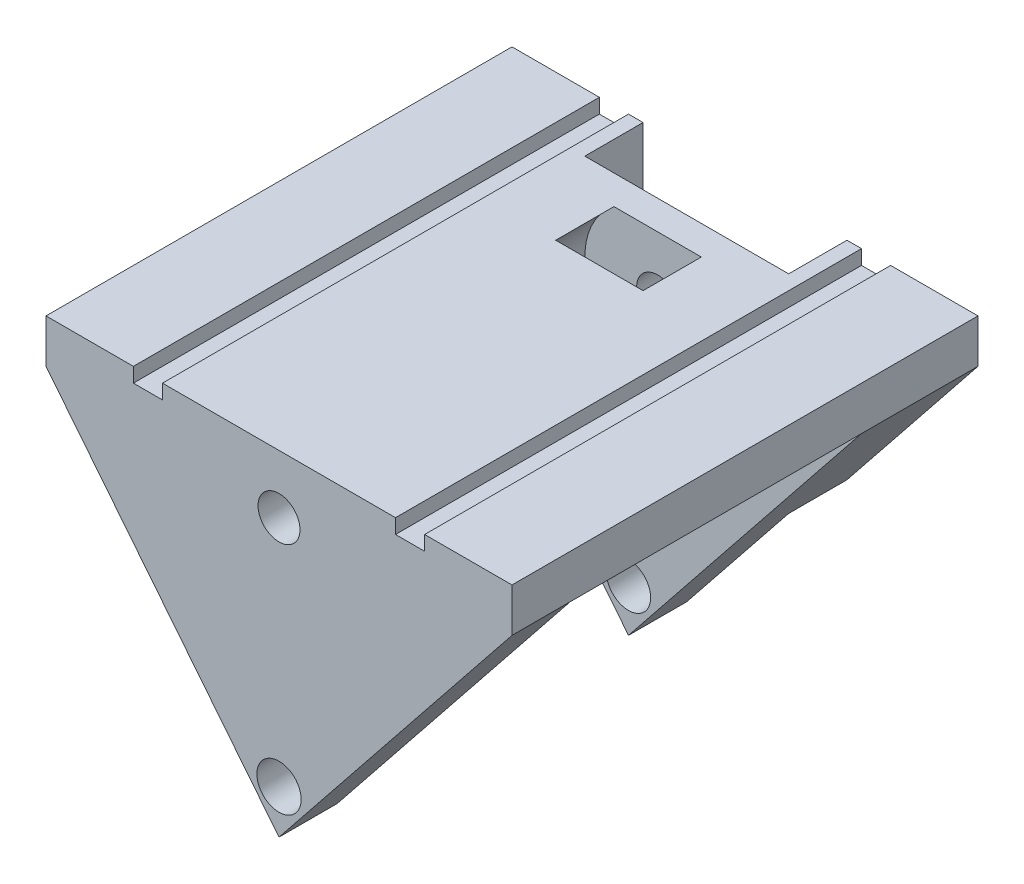
ISO-10303-21;
HEADER;
FILE_DESCRIPTION(('STEP AP214'),'2;1');
FILE_NAME('part.step','',(''),(''),'','','');
FILE_SCHEMA(('AUTOMOTIVE_DESIGN { 1 0 10303 214 1 1 1 1 }'));
ENDSEC;
DATA;
#1=APPLICATION_CONTEXT('core data for automotive mechanical design processes');
#2=APPLICATION_PROTOCOL_DEFINITION('international standard','automotive_design',2000,#1);
#3=PRODUCT_CONTEXT('',#1,'mechanical');
#4=PRODUCT('Part','Part','',(#3));
#5=PRODUCT_RELATED_PRODUCT_CATEGORY('part','',(#4));
#6=PRODUCT_DEFINITION_FORMATION('','',#4);
#7=PRODUCT_DEFINITION_CONTEXT('part definition',#1,'design');
#8=PRODUCT_DEFINITION('design','',#6,#7);
#9=PRODUCT_DEFINITION_SHAPE('','',#8);
#10=(LENGTH_UNIT() NAMED_UNIT(*) SI_UNIT(.MILLI.,.METRE.));
#11=(NAMED_UNIT(*) PLANE_ANGLE_UNIT() SI_UNIT($,.RADIAN.));
#12=(NAMED_UNIT(*) SI_UNIT($,.STERADIAN.) SOLID_ANGLE_UNIT());
#13=UNCERTAINTY_MEASURE_WITH_UNIT(LENGTH_MEASURE(1.E-05),#10,'distance_accuracy_value','');
#14=(GEOMETRIC_REPRESENTATION_CONTEXT(3) GLOBAL_UNCERTAINTY_ASSIGNED_CONTEXT((#13)) GLOBAL_UNIT_ASSIGNED_CONTEXT((#10,
#11,#12)) REPRESENTATION_CONTEXT('',''));
#15=CARTESIAN_POINT('',(0.,0.,0.));
#16=DIRECTION('',(0.,0.,1.));
#17=DIRECTION('',(1.,0.,0.));
#18=AXIS2_PLACEMENT_3D('',#15,#16,#17);
#19=CARTESIAN_POINT('',(0.,4.7625,0.));
#20=DIRECTION('',(0.,-1.,0.));
#21=DIRECTION('',(0.,0.,-1.));
#22=AXIS2_PLACEMENT_3D('',#19,#20,#21);
#23=PLANE('',#22);
#24=DIRECTION('',(1.,0.,0.));
#25=VECTOR('',#24,1.);
#26=CARTESIAN_POINT('',(14.2875,4.7625,-44.45));
#27=LINE('',#26,#25);
#28=CARTESIAN_POINT('',(14.2875,4.7625,-44.45));
#29=VERTEX_POINT('',#28);
#30=CARTESIAN_POINT('',(36.5125,4.7625,-44.45));
#31=VERTEX_POINT('',#30);
#32=EDGE_CURVE('E306',#29,#31,#27,.T.);
#33=ORIENTED_EDGE('',*,*,#32,.F.);
#34=DIRECTION('',(0.,0.,1.));
#35=VECTOR('',#34,1.);
#36=CARTESIAN_POINT('',(14.2875,4.7625,-50.8));
#37=LINE('',#36,#35);
#38=CARTESIAN_POINT('',(14.2875,4.7625,-50.8));
#39=VERTEX_POINT('',#38);
#40=EDGE_CURVE('E302',#39,#29,#37,.T.);
#41=ORIENTED_EDGE('',*,*,#40,.F.);
#42=DIRECTION('',(-1.,0.,0.));
#43=VECTOR('',#42,1.);
#44=CARTESIAN_POINT('',(0.,4.7625,-50.8));
#45=LINE('',#44,#43);
#46=CARTESIAN_POINT('',(12.7,4.7625,-50.8));
#47=VERTEX_POINT('',#46);
#48=EDGE_CURVE('E477',#39,#47,#45,.T.);
#49=ORIENTED_EDGE('',*,*,#48,.T.);
#50=DIRECTION('',(0.,0.,-1.));
#51=VECTOR('',#50,1.);
#52=CARTESIAN_POINT('',(12.7,4.7625,-50.8));
#53=LINE('',#52,#51);
#54=CARTESIAN_POINT('',(12.7,4.7625,0.));
#55=VERTEX_POINT('',#54);
#56=EDGE_CURVE('E388',#55,#47,#53,.T.);
#57=ORIENTED_EDGE('',*,*,#56,.F.);
#58=DIRECTION('',(1.,0.,0.));
#59=VECTOR('',#58,1.);
#60=CARTESIAN_POINT('',(0.,4.7625,0.));
#61=LINE('',#60,#59);
#62=CARTESIAN_POINT('',(38.1,4.7625,0.));
#63=VERTEX_POINT('',#62);
#64=EDGE_CURVE('E467',#55,#63,#61,.T.);
#65=ORIENTED_EDGE('',*,*,#64,.T.);
#66=DIRECTION('',(0.,0.,1.));
#67=VECTOR('',#66,1.);
#68=CARTESIAN_POINT('',(38.1,4.7625,-50.8));
#69=LINE('',#68,#67);
#70=CARTESIAN_POINT('',(38.1,4.7625,-50.8));
#71=VERTEX_POINT('',#70);
#72=EDGE_CURVE('E404',#71,#63,#69,.T.);
#73=ORIENTED_EDGE('',*,*,#72,.F.);
#74=CARTESIAN_POINT('',(36.5125,4.7625,-50.8));
#75=VERTEX_POINT('',#74);
#76=EDGE_CURVE('E476',#71,#75,#45,.T.);
#77=ORIENTED_EDGE('',*,*,#76,.T.);
#78=DIRECTION('',(0.,0.,-1.));
#79=VECTOR('',#78,1.);
#80=CARTESIAN_POINT('',(36.5125,4.7625,-50.8));
#81=LINE('',#80,#79);
#82=EDGE_CURVE('E310',#31,#75,#81,.T.);
#83=ORIENTED_EDGE('',*,*,#82,.F.);
#84=EDGE_LOOP('',(#33,#41,#49,#57,#65,#73,#77,#83));
#85=FACE_BOUND('',#84,.T.);
#86=DIRECTION('',(-1.,0.,0.));
#87=VECTOR('',#86,1.);
#88=CARTESIAN_POINT('',(0.,4.7625,-41.275));
#89=LINE('',#88,#87);
#90=CARTESIAN_POINT('',(30.1625,4.7625,-41.275));
#91=VERTEX_POINT('',#90);
#92=CARTESIAN_POINT('',(20.6375,4.7625,-41.275));
#93=VERTEX_POINT('',#92);
#94=EDGE_CURVE('E233',#91,#93,#89,.T.);
#95=ORIENTED_EDGE('',*,*,#94,.F.);
#96=DIRECTION('',(0.,0.,1.));
#97=VECTOR('',#96,1.);
#98=CARTESIAN_POINT('',(30.1625,4.7625,-41.275));
#99=LINE('',#98,#97);
#100=CARTESIAN_POINT('',(30.1625,4.7625,-34.925));
#101=VERTEX_POINT('',#100);
#102=EDGE_CURVE('E265',#91,#101,#99,.T.);
#103=ORIENTED_EDGE('',*,*,#102,.T.);
#104=DIRECTION('',(-1.,0.,0.));
#105=VECTOR('',#104,1.);
#106=CARTESIAN_POINT('',(0.,4.7625,-34.925));
#107=LINE('',#106,#105);
#108=CARTESIAN_POINT('',(20.6375,4.7625,-34.925));
#109=VERTEX_POINT('',#108);
#110=EDGE_CURVE('E237',#101,#109,#107,.T.);
#111=ORIENTED_EDGE('',*,*,#110,.T.);
#112=DIRECTION('',(0.,0.,1.));
#113=VECTOR('',#112,1.);
#114=CARTESIAN_POINT('',(20.6375,4.7625,-41.275));
#115=LINE('',#114,#113);
#116=EDGE_CURVE('E261',#109,#93,#115,.F.);
#117=ORIENTED_EDGE('',*,*,#116,.T.);
#118=EDGE_LOOP('',(#95,#103,#111,#117));
#119=FACE_BOUND('',#118,.T.);
#120=ADVANCED_FACE('F49',(#85,#119),#23,.F.);
#121=CARTESIAN_POINT('',(25.4,-1.5875,6.35));
#122=DIRECTION('',(0.,0.,-1.));
#123=DIRECTION('',(-1.,0.,0.));
#124=AXIS2_PLACEMENT_3D('',#121,#122,#123);
#125=CYLINDRICAL_SURFACE('',#124,2.286);
#126=CARTESIAN_POINT('',(25.4,-1.5875,-44.45));
#127=DIRECTION('',(0.,0.,-1.));
#128=DIRECTION('',(-1.,0.,0.));
#129=AXIS2_PLACEMENT_3D('',#126,#127,#128);
#130=CIRCLE('',#129,2.286);
#131=CARTESIAN_POINT('',(23.114,-1.5875,-44.45));
#132=VERTEX_POINT('',#131);
#133=EDGE_CURVE('E268',#132,#132,#130,.T.);
#134=ORIENTED_EDGE('',*,*,#133,.T.);
#135=EDGE_LOOP('',(#134));
#136=FACE_BOUND('',#135,.T.);
#137=CARTESIAN_POINT('',(25.4,-1.5875,-41.275));
#138=DIRECTION('',(0.,0.,1.));
#139=DIRECTION('',(1.,0.,0.));
#140=AXIS2_PLACEMENT_3D('',#137,#138,#139);
#141=CIRCLE('',#140,2.286);
#142=CARTESIAN_POINT('',(27.686,-1.5875,-41.275));
#143=VERTEX_POINT('',#142);
#144=EDGE_CURVE('E256',#143,#143,#141,.F.);
#145=ORIENTED_EDGE('',*,*,#144,.F.);
#146=EDGE_LOOP('',(#145));
#147=FACE_BOUND('',#146,.T.);
#148=ADVANCED_FACE('F520',(#136,#147),#125,.F.);
#149=CARTESIAN_POINT('',(0.,0.,0.));
#150=DIRECTION('',(0.,-1.,0.));
#151=DIRECTION('',(0.,0.,-1.));
#152=AXIS2_PLACEMENT_3D('',#149,#150,#151);
#153=PLANE('',#152);
#154=DIRECTION('',(0.,0.,1.));
#155=VECTOR('',#154,1.);
#156=CARTESIAN_POINT('',(17.6228700666634,0.,-41.275));
#157=LINE('',#156,#155);
#158=CARTESIAN_POINT('',(17.6228700666634,0.,-34.925));
#159=VERTEX_POINT('',#158);
#160=CARTESIAN_POINT('',(17.6228700666634,0.,-38.1));
#161=VERTEX_POINT('',#160);
#162=EDGE_CURVE('E232',#159,#161,#157,.F.);
#163=ORIENTED_EDGE('',*,*,#162,.F.);
#164=DIRECTION('',(-1.,0.,0.));
#165=VECTOR('',#164,1.);
#166=CARTESIAN_POINT('',(0.,0.,-34.925));
#167=LINE('',#166,#165);
#168=CARTESIAN_POINT('',(23.7551171014325,0.,-34.925));
#169=VERTEX_POINT('',#168);
#170=EDGE_CURVE('E246',#169,#159,#167,.T.);
#171=ORIENTED_EDGE('',*,*,#170,.F.);
#172=DIRECTION('',(0.,0.,-1.));
#173=VECTOR('',#172,1.);
#174=CARTESIAN_POINT('',(23.7551171014325,0.,6.35));
#175=LINE('',#174,#173);
#176=CARTESIAN_POINT('',(23.7551171014325,0.,-6.35));
#177=VERTEX_POINT('',#176);
#178=EDGE_CURVE('E278',#177,#169,#175,.T.);
#179=ORIENTED_EDGE('',*,*,#178,.F.);
#180=DIRECTION('',(1.,0.,0.));
#181=VECTOR('',#180,1.);
#182=CARTESIAN_POINT('',(0.,0.,-6.35));
#183=LINE('',#182,#181);
#184=CARTESIAN_POINT('',(0.,0.,-6.35));
#185=VERTEX_POINT('',#184);
#186=EDGE_CURVE('E356',#185,#177,#183,.T.);
#187=ORIENTED_EDGE('',*,*,#186,.F.);
#188=DIRECTION('',(0.,0.,1.));
#189=VECTOR('',#188,1.);
#190=CARTESIAN_POINT('',(0.,0.,0.));
#191=LINE('',#190,#189);
#192=CARTESIAN_POINT('',(0.,0.,-38.1));
#193=VERTEX_POINT('',#192);
#194=EDGE_CURVE('E411',#193,#185,#191,.T.);
#195=ORIENTED_EDGE('',*,*,#194,.F.);
#196=DIRECTION('',(-1.,0.,0.));
#197=VECTOR('',#196,1.);
#198=CARTESIAN_POINT('',(0.,0.,-38.1));
#199=LINE('',#198,#197);
#200=EDGE_CURVE('E338',#161,#193,#199,.T.);
#201=ORIENTED_EDGE('',*,*,#200,.F.);
#202=EDGE_LOOP('',(#163,#171,#179,#187,#195,#201));
#203=FACE_BOUND('',#202,.T.);
#204=ADVANCED_FACE('F522',(#203),#153,.T.);
#205=CARTESIAN_POINT('',(0.,4.7625,-50.8));
#206=DIRECTION('',(0.,0.,1.));
#207=DIRECTION('',(1.,0.,0.));
#208=AXIS2_PLACEMENT_3D('',#205,#206,#207);
#209=PLANE('',#208);
#210=ORIENTED_EDGE('',*,*,#48,.F.);
#211=DIRECTION('',(0.,1.,0.));
#212=VECTOR('',#211,1.);
#213=CARTESIAN_POINT('',(14.2875,-39.6875,-50.8));
#214=LINE('',#213,#212);
#215=CARTESIAN_POINT('',(14.2875,-17.859375,-50.8));
#216=VERTEX_POINT('',#215);
#217=EDGE_CURVE('E314',#216,#39,#214,.T.);
#218=ORIENTED_EDGE('',*,*,#217,.F.);
#219=DIRECTION('',(0.624695047554424,-0.78086880944303,0.));
#220=VECTOR('',#219,1.);
#221=CARTESIAN_POINT('',(0.,0.,-50.8));
#222=LINE('',#221,#220);
#223=CARTESIAN_POINT('',(0.,0.,-50.8));
#224=VERTEX_POINT('',#223);
#225=EDGE_CURVE('E335',#224,#216,#222,.T.);
#226=ORIENTED_EDGE('',*,*,#225,.F.);
#227=DIRECTION('',(0.,-1.,0.));
#228=VECTOR('',#227,1.);
#229=CARTESIAN_POINT('',(0.,4.7625,-50.8));
#230=LINE('',#229,#228);
#231=CARTESIAN_POINT('',(0.,4.7625,-50.8));
#232=VERTEX_POINT('',#231);
#233=EDGE_CURVE('E475',#232,#224,#230,.T.);
#234=ORIENTED_EDGE('',*,*,#233,.F.);
#235=CARTESIAN_POINT('',(9.525,4.7625,-50.8));
#236=VERTEX_POINT('',#235);
#237=EDGE_CURVE('E470',#236,#232,#45,.T.);
#238=ORIENTED_EDGE('',*,*,#237,.F.);
#239=DIRECTION('',(0.,1.,0.));
#240=VECTOR('',#239,1.);
#241=CARTESIAN_POINT('',(9.525,3.175,-50.8));
#242=LINE('',#241,#240);
#243=CARTESIAN_POINT('',(9.525,3.175,-50.8));
#244=VERTEX_POINT('',#243);
#245=EDGE_CURVE('E408',#244,#236,#242,.T.);
#246=ORIENTED_EDGE('',*,*,#245,.F.);
#247=DIRECTION('',(-1.,0.,0.));
#248=VECTOR('',#247,1.);
#249=CARTESIAN_POINT('',(9.525,3.175,-50.8));
#250=LINE('',#249,#248);
#251=CARTESIAN_POINT('',(12.7,3.175,-50.8));
#252=VERTEX_POINT('',#251);
#253=EDGE_CURVE('E396',#252,#244,#250,.T.);
#254=ORIENTED_EDGE('',*,*,#253,.F.);
#255=DIRECTION('',(0.,1.,0.));
#256=VECTOR('',#255,1.);
#257=CARTESIAN_POINT('',(12.7,3.175,-50.8));
#258=LINE('',#257,#256);
#259=EDGE_CURVE('E412',#252,#47,#258,.T.);
#260=ORIENTED_EDGE('',*,*,#259,.T.);
#261=EDGE_LOOP('',(#210,#218,#226,#234,#238,#246,#254,#260));
#262=FACE_BOUND('',#261,.T.);
#263=ADVANCED_FACE('F530',(#262),#209,.F.);
#264=DIRECTION('',(0.,0.,1.));
#265=VECTOR('',#264,1.);
#266=CARTESIAN_POINT('',(33.1771299333366,0.,-41.275));
#267=LINE('',#266,#265);
#268=CARTESIAN_POINT('',(33.1771299333366,0.,-38.1));
#269=VERTEX_POINT('',#268);
#270=CARTESIAN_POINT('',(33.1771299333366,0.,-34.925));
#271=VERTEX_POINT('',#270);
#272=EDGE_CURVE('E223',#269,#271,#267,.T.);
#273=ORIENTED_EDGE('',*,*,#272,.F.);
#274=CARTESIAN_POINT('',(50.8,0.,-38.1));
#275=VERTEX_POINT('',#274);
#276=EDGE_CURVE('E339',#275,#269,#199,.T.);
#277=ORIENTED_EDGE('',*,*,#276,.F.);
#278=DIRECTION('',(0.,0.,-1.));
#279=VECTOR('',#278,1.);
#280=CARTESIAN_POINT('',(50.8,0.,0.));
#281=LINE('',#280,#279);
#282=CARTESIAN_POINT('',(50.8,0.,-6.35));
#283=VERTEX_POINT('',#282);
#284=EDGE_CURVE('E482',#283,#275,#281,.T.);
#285=ORIENTED_EDGE('',*,*,#284,.F.);
#286=CARTESIAN_POINT('',(27.0448828985676,0.,-6.35));
#287=VERTEX_POINT('',#286);
#288=EDGE_CURVE('E361',#287,#283,#183,.T.);
#289=ORIENTED_EDGE('',*,*,#288,.F.);
#290=DIRECTION('',(0.,0.,-1.));
#291=VECTOR('',#290,1.);
#292=CARTESIAN_POINT('',(27.0448828985676,0.,6.35));
#293=LINE('',#292,#291);
#294=CARTESIAN_POINT('',(27.0448828985676,0.,-34.925));
#295=VERTEX_POINT('',#294);
#296=EDGE_CURVE('E244',#295,#287,#293,.F.);
#297=ORIENTED_EDGE('',*,*,#296,.F.);
#298=DIRECTION('',(-1.,0.,0.));
#299=VECTOR('',#298,1.);
#300=CARTESIAN_POINT('',(0.,0.,-34.925));
#301=LINE('',#300,#299);
#302=EDGE_CURVE('E72',#271,#295,#301,.T.);
#303=ORIENTED_EDGE('',*,*,#302,.F.);
#304=EDGE_LOOP('',(#273,#277,#285,#289,#297,#303));
#305=FACE_BOUND('',#304,.T.);
#306=ADVANCED_FACE('F242',(#305),#153,.T.);
#307=CARTESIAN_POINT('',(0.,4.7625,0.));
#308=VERTEX_POINT('',#307);
#309=CARTESIAN_POINT('',(9.52500000000001,4.7625,0.));
#310=VERTEX_POINT('',#309);
#311=EDGE_CURVE('E462',#308,#310,#61,.T.);
#312=ORIENTED_EDGE('',*,*,#311,.T.);
#313=DIRECTION('',(0.,0.,1.));
#314=VECTOR('',#313,1.);
#315=CARTESIAN_POINT('',(9.525,4.7625,-50.8));
#316=LINE('',#315,#314);
#317=EDGE_CURVE('E401',#236,#310,#316,.T.);
#318=ORIENTED_EDGE('',*,*,#317,.F.);
#319=ORIENTED_EDGE('',*,*,#237,.T.);
#320=DIRECTION('',(0.,0.,1.));
#321=VECTOR('',#320,1.);
#322=CARTESIAN_POINT('',(0.,4.7625,0.));
#323=LINE('',#322,#321);
#324=EDGE_CURVE('E456',#232,#308,#323,.T.);
#325=ORIENTED_EDGE('',*,*,#324,.T.);
#326=EDGE_LOOP('',(#312,#318,#319,#325));
#327=FACE_BOUND('',#326,.T.);
#328=ADVANCED_FACE('F535',(#327),#23,.F.);
#329=CARTESIAN_POINT('',(0.,4.7625,0.));
#330=DIRECTION('',(1.,0.,0.));
#331=DIRECTION('',(0.,0.,-1.));
#332=AXIS2_PLACEMENT_3D('',#329,#330,#331);
#333=PLANE('',#332);
#334=EDGE_CURVE('E478',#224,#193,#191,.T.);
#335=ORIENTED_EDGE('',*,*,#334,.T.);
#336=ORIENTED_EDGE('',*,*,#194,.T.);
#337=DIRECTION('',(0.,0.,1.));
#338=VECTOR('',#337,1.);
#339=CARTESIAN_POINT('',(0.,0.,-6.35));
#340=LINE('',#339,#338);
#341=CARTESIAN_POINT('',(0.,0.,0.));
#342=VERTEX_POINT('',#341);
#343=EDGE_CURVE('E369',#185,#342,#340,.T.);
#344=ORIENTED_EDGE('',*,*,#343,.T.);
#345=DIRECTION('',(0.,-1.,0.));
#346=VECTOR('',#345,1.);
#347=CARTESIAN_POINT('',(0.,4.7625,0.));
#348=LINE('',#347,#346);
#349=EDGE_CURVE('E496',#308,#342,#348,.T.);
#350=ORIENTED_EDGE('',*,*,#349,.F.);
#351=ORIENTED_EDGE('',*,*,#324,.F.);
#352=ORIENTED_EDGE('',*,*,#233,.T.);
#353=EDGE_LOOP('',(#335,#336,#344,#350,#351,#352));
#354=FACE_BOUND('',#353,.T.);
#355=ADVANCED_FACE('F51',(#354),#333,.F.);
#356=CARTESIAN_POINT('',(0.,4.7625,0.));
#357=DIRECTION('',(0.,0.,-1.));
#358=DIRECTION('',(-1.,0.,0.));
#359=AXIS2_PLACEMENT_3D('',#356,#357,#358);
#360=PLANE('',#359);
#361=CARTESIAN_POINT('',(25.4,-26.9875,0.));
#362=DIRECTION('',(0.,0.,-1.));
#363=DIRECTION('',(-1.,0.,0.));
#364=AXIS2_PLACEMENT_3D('',#361,#362,#363);
#365=CIRCLE('',#364,2.413);
#366=CARTESIAN_POINT('',(22.987,-26.9875,0.));
#367=VERTEX_POINT('',#366);
#368=EDGE_CURVE('E298',#367,#367,#365,.T.);
#369=ORIENTED_EDGE('',*,*,#368,.T.);
#370=EDGE_LOOP('',(#369));
#371=FACE_BOUND('',#370,.T.);
#372=CARTESIAN_POINT('',(25.4,-1.5875,0.));
#373=DIRECTION('',(0.,0.,-1.));
#374=DIRECTION('',(-1.,0.,0.));
#375=AXIS2_PLACEMENT_3D('',#372,#373,#374);
#376=CIRCLE('',#375,2.286);
#377=CARTESIAN_POINT('',(23.114,-1.5875,0.));
#378=VERTEX_POINT('',#377);
#379=EDGE_CURVE('E286',#378,#378,#376,.T.);
#380=ORIENTED_EDGE('',*,*,#379,.T.);
#381=EDGE_LOOP('',(#380));
#382=FACE_BOUND('',#381,.T.);
#383=DIRECTION('',(1.,0.,0.));
#384=VECTOR('',#383,1.);
#385=CARTESIAN_POINT('',(9.52500000000001,3.175,0.));
#386=LINE('',#385,#384);
#387=CARTESIAN_POINT('',(9.52500000000001,3.175,0.));
#388=VERTEX_POINT('',#387);
#389=CARTESIAN_POINT('',(12.7,3.175,0.));
#390=VERTEX_POINT('',#389);
#391=EDGE_CURVE('E387',#388,#390,#386,.T.);
#392=ORIENTED_EDGE('',*,*,#391,.F.);
#393=DIRECTION('',(0.,1.,0.));
#394=VECTOR('',#393,1.);
#395=CARTESIAN_POINT('',(9.52500000000001,3.175,0.));
#396=LINE('',#395,#394);
#397=EDGE_CURVE('E400',#388,#310,#396,.T.);
#398=ORIENTED_EDGE('',*,*,#397,.T.);
#399=ORIENTED_EDGE('',*,*,#311,.F.);
#400=ORIENTED_EDGE('',*,*,#349,.T.);
#401=DIRECTION('',(-0.624695047554424,0.78086880944303,0.));
#402=VECTOR('',#401,1.);
#403=CARTESIAN_POINT('',(0.,0.,0.));
#404=LINE('',#403,#402);
#405=CARTESIAN_POINT('',(25.4,-31.75,0.));
#406=VERTEX_POINT('',#405);
#407=EDGE_CURVE('E352',#406,#342,#404,.T.);
#408=ORIENTED_EDGE('',*,*,#407,.F.);
#409=DIRECTION('',(0.624695047554424,0.78086880944303,0.));
#410=VECTOR('',#409,1.);
#411=CARTESIAN_POINT('',(30.9756097560976,-24.780487804878,0.));
#412=LINE('',#411,#410);
#413=CARTESIAN_POINT('',(50.8,0.,0.));
#414=VERTEX_POINT('',#413);
#415=EDGE_CURVE('E373',#406,#414,#412,.T.);
#416=ORIENTED_EDGE('',*,*,#415,.T.);
#417=DIRECTION('',(0.,-1.,0.));
#418=VECTOR('',#417,1.);
#419=CARTESIAN_POINT('',(50.8,4.7625,0.));
#420=LINE('',#419,#418);
#421=CARTESIAN_POINT('',(50.8,4.7625,0.));
#422=VERTEX_POINT('',#421);
#423=EDGE_CURVE('E493',#422,#414,#420,.T.);
#424=ORIENTED_EDGE('',*,*,#423,.F.);
#425=CARTESIAN_POINT('',(41.275,4.7625,0.));
#426=VERTEX_POINT('',#425);
#427=EDGE_CURVE('E460',#426,#422,#61,.T.);
#428=ORIENTED_EDGE('',*,*,#427,.F.);
#429=DIRECTION('',(0.,1.,0.));
#430=VECTOR('',#429,1.);
#431=CARTESIAN_POINT('',(41.275,3.175,0.));
#432=LINE('',#431,#430);
#433=CARTESIAN_POINT('',(41.275,3.175,0.));
#434=VERTEX_POINT('',#433);
#435=EDGE_CURVE('E427',#434,#426,#432,.T.);
#436=ORIENTED_EDGE('',*,*,#435,.F.);
#437=DIRECTION('',(1.,0.,0.));
#438=VECTOR('',#437,1.);
#439=CARTESIAN_POINT('',(38.1,3.175,0.));
#440=LINE('',#439,#438);
#441=CARTESIAN_POINT('',(38.1,3.175,0.));
#442=VERTEX_POINT('',#441);
#443=EDGE_CURVE('E449',#442,#434,#440,.T.);
#444=ORIENTED_EDGE('',*,*,#443,.F.);
#445=DIRECTION('',(0.,1.,0.));
#446=VECTOR('',#445,1.);
#447=CARTESIAN_POINT('',(38.1,3.175,0.));
#448=LINE('',#447,#446);
#449=EDGE_CURVE('E422',#442,#63,#448,.T.);
#450=ORIENTED_EDGE('',*,*,#449,.T.);
#451=ORIENTED_EDGE('',*,*,#64,.F.);
#452=DIRECTION('',(0.,1.,0.));
#453=VECTOR('',#452,1.);
#454=CARTESIAN_POINT('',(12.7,3.175,0.));
#455=LINE('',#454,#453);
#456=EDGE_CURVE('E416',#390,#55,#455,.T.);
#457=ORIENTED_EDGE('',*,*,#456,.F.);
#458=EDGE_LOOP('',(#392,#398,#399,#400,#408,#416,#424,#428,#436,#444,#450,#451,#457));
#459=FACE_BOUND('',#458,.T.);
#460=ADVANCED_FACE('F558',(#371,#382,#459),#360,.F.);
#461=CARTESIAN_POINT('',(50.8,4.7625,0.));
#462=DIRECTION('',(-1.,0.,0.));
#463=DIRECTION('',(0.,0.,1.));
#464=AXIS2_PLACEMENT_3D('',#461,#462,#463);
#465=PLANE('',#464);
#466=EDGE_CURVE('E461',#414,#283,#281,.T.);
#467=ORIENTED_EDGE('',*,*,#466,.T.);
#468=ORIENTED_EDGE('',*,*,#284,.T.);
#469=DIRECTION('',(0.,0.,-1.));
#470=VECTOR('',#469,1.);
#471=CARTESIAN_POINT('',(50.8,0.,-38.1));
#472=LINE('',#471,#470);
#473=CARTESIAN_POINT('',(50.8,0.,-50.8));
#474=VERTEX_POINT('',#473);
#475=EDGE_CURVE('E348',#275,#474,#472,.T.);
#476=ORIENTED_EDGE('',*,*,#475,.T.);
#477=DIRECTION('',(0.,-1.,0.));
#478=VECTOR('',#477,1.);
#479=CARTESIAN_POINT('',(50.8,4.7625,-50.8));
#480=LINE('',#479,#478);
#481=CARTESIAN_POINT('',(50.8,4.7625,-50.8));
#482=VERTEX_POINT('',#481);
#483=EDGE_CURVE('E489',#482,#474,#480,.T.);
#484=ORIENTED_EDGE('',*,*,#483,.F.);
#485=DIRECTION('',(0.,0.,-1.));
#486=VECTOR('',#485,1.);
#487=CARTESIAN_POINT('',(50.8,4.7625,0.));
#488=LINE('',#487,#486);
#489=EDGE_CURVE('E466',#422,#482,#488,.T.);
#490=ORIENTED_EDGE('',*,*,#489,.F.);
#491=ORIENTED_EDGE('',*,*,#423,.T.);
#492=EDGE_LOOP('',(#467,#468,#476,#484,#490,#491));
#493=FACE_BOUND('',#492,.T.);
#494=ADVANCED_FACE('F561',(#493),#465,.F.);
#495=DIRECTION('',(0.624695047554424,0.78086880944303,0.));
#496=VECTOR('',#495,1.);
#497=CARTESIAN_POINT('',(30.9756097560976,-24.780487804878,-50.8));
#498=LINE('',#497,#496);
#499=CARTESIAN_POINT('',(36.5125,-17.859375,-50.8));
#500=VERTEX_POINT('',#499);
#501=EDGE_CURVE('E330',#500,#474,#498,.T.);
#502=ORIENTED_EDGE('',*,*,#501,.F.);
#503=DIRECTION('',(0.,1.,0.));
#504=VECTOR('',#503,1.);
#505=CARTESIAN_POINT('',(36.5125,-39.6875,-50.8));
#506=LINE('',#505,#504);
#507=EDGE_CURVE('E318',#500,#75,#506,.T.);
#508=ORIENTED_EDGE('',*,*,#507,.T.);
#509=ORIENTED_EDGE('',*,*,#76,.F.);
#510=DIRECTION('',(0.,1.,0.));
#511=VECTOR('',#510,1.);
#512=CARTESIAN_POINT('',(38.1,3.175,-50.8));
#513=LINE('',#512,#511);
#514=CARTESIAN_POINT('',(38.1,3.175,-50.8));
#515=VERTEX_POINT('',#514);
#516=EDGE_CURVE('E380',#515,#71,#513,.T.);
#517=ORIENTED_EDGE('',*,*,#516,.F.);
#518=DIRECTION('',(-1.,0.,0.));
#519=VECTOR('',#518,1.);
#520=CARTESIAN_POINT('',(38.1,3.175,-50.8));
#521=LINE('',#520,#519);
#522=CARTESIAN_POINT('',(41.275,3.175,-50.8));
#523=VERTEX_POINT('',#522);
#524=EDGE_CURVE('E426',#523,#515,#521,.T.);
#525=ORIENTED_EDGE('',*,*,#524,.F.);
#526=DIRECTION('',(0.,1.,0.));
#527=VECTOR('',#526,1.);
#528=CARTESIAN_POINT('',(41.275,3.175,-50.8));
#529=LINE('',#528,#527);
#530=CARTESIAN_POINT('',(41.275,4.7625,-50.8));
#531=VERTEX_POINT('',#530);
#532=EDGE_CURVE('E430',#523,#531,#529,.T.);
#533=ORIENTED_EDGE('',*,*,#532,.T.);
#534=EDGE_CURVE('E471',#482,#531,#45,.T.);
#535=ORIENTED_EDGE('',*,*,#534,.F.);
#536=ORIENTED_EDGE('',*,*,#483,.T.);
#537=EDGE_LOOP('',(#502,#508,#509,#517,#525,#533,#535,#536));
#538=FACE_BOUND('',#537,.T.);
#539=ADVANCED_FACE('F592',(#538),#209,.F.);
#540=ORIENTED_EDGE('',*,*,#534,.T.);
#541=DIRECTION('',(0.,0.,-1.));
#542=VECTOR('',#541,1.);
#543=CARTESIAN_POINT('',(41.275,4.7625,-50.8));
#544=LINE('',#543,#542);
#545=EDGE_CURVE('E436',#426,#531,#544,.T.);
#546=ORIENTED_EDGE('',*,*,#545,.F.);
#547=ORIENTED_EDGE('',*,*,#427,.T.);
#548=ORIENTED_EDGE('',*,*,#489,.T.);
#549=EDGE_LOOP('',(#540,#546,#547,#548));
#550=FACE_BOUND('',#549,.T.);
#551=ADVANCED_FACE('F536',(#550),#23,.F.);
#552=CARTESIAN_POINT('',(38.1,3.175,-50.8));
#553=DIRECTION('',(-1.,0.,0.));
#554=DIRECTION('',(0.,0.,1.));
#555=AXIS2_PLACEMENT_3D('',#552,#553,#554);
#556=PLANE('',#555);
#557=ORIENTED_EDGE('',*,*,#72,.T.);
#558=ORIENTED_EDGE('',*,*,#449,.F.);
#559=DIRECTION('',(0.,0.,1.));
#560=VECTOR('',#559,1.);
#561=CARTESIAN_POINT('',(38.1,3.175,-50.8));
#562=LINE('',#561,#560);
#563=EDGE_CURVE('E439',#515,#442,#562,.T.);
#564=ORIENTED_EDGE('',*,*,#563,.F.);
#565=ORIENTED_EDGE('',*,*,#516,.T.);
#566=EDGE_LOOP('',(#557,#558,#564,#565));
#567=FACE_BOUND('',#566,.T.);
#568=ADVANCED_FACE('F626',(#567),#556,.F.);
#569=CARTESIAN_POINT('',(41.275,3.175,-50.8));
#570=DIRECTION('',(1.,0.,0.));
#571=DIRECTION('',(0.,0.,-1.));
#572=AXIS2_PLACEMENT_3D('',#569,#570,#571);
#573=PLANE('',#572);
#574=ORIENTED_EDGE('',*,*,#545,.T.);
#575=ORIENTED_EDGE('',*,*,#532,.F.);
#576=DIRECTION('',(0.,0.,-1.));
#577=VECTOR('',#576,1.);
#578=CARTESIAN_POINT('',(41.275,3.175,-50.8));
#579=LINE('',#578,#577);
#580=EDGE_CURVE('E445',#434,#523,#579,.T.);
#581=ORIENTED_EDGE('',*,*,#580,.F.);
#582=ORIENTED_EDGE('',*,*,#435,.T.);
#583=EDGE_LOOP('',(#574,#575,#581,#582));
#584=FACE_BOUND('',#583,.T.);
#585=ADVANCED_FACE('F629',(#584),#573,.F.);
#586=CARTESIAN_POINT('',(0.,3.175,0.));
#587=DIRECTION('',(0.,1.,0.));
#588=DIRECTION('',(0.,0.,1.));
#589=AXIS2_PLACEMENT_3D('',#586,#587,#588);
#590=PLANE('',#589);
#591=ORIENTED_EDGE('',*,*,#563,.T.);
#592=ORIENTED_EDGE('',*,*,#443,.T.);
#593=ORIENTED_EDGE('',*,*,#580,.T.);
#594=ORIENTED_EDGE('',*,*,#524,.T.);
#595=EDGE_LOOP('',(#591,#592,#593,#594));
#596=FACE_BOUND('',#595,.T.);
#597=ADVANCED_FACE('F622',(#596),#590,.T.);
#598=CARTESIAN_POINT('',(9.525,3.175,-50.8));
#599=DIRECTION('',(-1.,0.,0.));
#600=DIRECTION('',(0.,0.,1.));
#601=AXIS2_PLACEMENT_3D('',#598,#599,#600);
#602=PLANE('',#601);
#603=ORIENTED_EDGE('',*,*,#317,.T.);
#604=ORIENTED_EDGE('',*,*,#397,.F.);
#605=DIRECTION('',(0.,0.,1.));
#606=VECTOR('',#605,1.);
#607=CARTESIAN_POINT('',(9.525,3.175,-50.8));
#608=LINE('',#607,#606);
#609=EDGE_CURVE('E383',#244,#388,#608,.T.);
#610=ORIENTED_EDGE('',*,*,#609,.F.);
#611=ORIENTED_EDGE('',*,*,#245,.T.);
#612=EDGE_LOOP('',(#603,#604,#610,#611));
#613=FACE_BOUND('',#612,.T.);
#614=ADVANCED_FACE('F571',(#613),#602,.F.);
#615=CARTESIAN_POINT('',(12.7,3.175,-50.8));
#616=DIRECTION('',(1.,0.,0.));
#617=DIRECTION('',(0.,0.,-1.));
#618=AXIS2_PLACEMENT_3D('',#615,#616,#617);
#619=PLANE('',#618);
#620=ORIENTED_EDGE('',*,*,#56,.T.);
#621=ORIENTED_EDGE('',*,*,#259,.F.);
#622=DIRECTION('',(0.,0.,-1.));
#623=VECTOR('',#622,1.);
#624=CARTESIAN_POINT('',(12.7,3.175,-50.8));
#625=LINE('',#624,#623);
#626=EDGE_CURVE('E392',#390,#252,#625,.T.);
#627=ORIENTED_EDGE('',*,*,#626,.F.);
#628=ORIENTED_EDGE('',*,*,#456,.T.);
#629=EDGE_LOOP('',(#620,#621,#627,#628));
#630=FACE_BOUND('',#629,.T.);
#631=ADVANCED_FACE('F613',(#630),#619,.F.);
#632=CARTESIAN_POINT('',(0.,3.175,0.));
#633=DIRECTION('',(0.,1.,0.));
#634=DIRECTION('',(0.,0.,1.));
#635=AXIS2_PLACEMENT_3D('',#632,#633,#634);
#636=PLANE('',#635);
#637=ORIENTED_EDGE('',*,*,#609,.T.);
#638=ORIENTED_EDGE('',*,*,#391,.T.);
#639=ORIENTED_EDGE('',*,*,#626,.T.);
#640=ORIENTED_EDGE('',*,*,#253,.T.);
#641=EDGE_LOOP('',(#637,#638,#639,#640));
#642=FACE_BOUND('',#641,.T.);
#643=ADVANCED_FACE('F567',(#642),#636,.T.);
#644=CARTESIAN_POINT('',(30.9756097560976,-24.780487804878,-6.35));
#645=DIRECTION('',(0.78086880944303,-0.624695047554424,0.));
#646=DIRECTION('',(0.624695047554424,0.780868809443031,0.));
#647=AXIS2_PLACEMENT_3D('',#644,#645,#646);
#648=PLANE('',#647);
#649=ORIENTED_EDGE('',*,*,#415,.F.);
#650=DIRECTION('',(0.,0.,1.));
#651=VECTOR('',#650,1.);
#652=CARTESIAN_POINT('',(25.4,-31.75,-6.35));
#653=LINE('',#652,#651);
#654=CARTESIAN_POINT('',(25.4,-31.75,-6.35));
#655=VERTEX_POINT('',#654);
#656=EDGE_CURVE('E377',#655,#406,#653,.T.);
#657=ORIENTED_EDGE('',*,*,#656,.F.);
#658=DIRECTION('',(0.624695047554424,0.78086880944303,0.));
#659=VECTOR('',#658,1.);
#660=CARTESIAN_POINT('',(30.9756097560976,-24.780487804878,-6.35));
#661=LINE('',#660,#659);
#662=EDGE_CURVE('E365',#655,#283,#661,.T.);
#663=ORIENTED_EDGE('',*,*,#662,.T.);
#664=ORIENTED_EDGE('',*,*,#466,.F.);
#665=EDGE_LOOP('',(#649,#657,#663,#664));
#666=FACE_BOUND('',#665,.T.);
#667=ADVANCED_FACE('F620',(#666),#648,.T.);
#668=CARTESIAN_POINT('',(0.,0.,-6.35));
#669=DIRECTION('',(0.78086880944303,0.624695047554424,0.));
#670=DIRECTION('',(-0.624695047554424,0.78086880944303,0.));
#671=AXIS2_PLACEMENT_3D('',#668,#669,#670);
#672=PLANE('',#671);
#673=ORIENTED_EDGE('',*,*,#407,.T.);
#674=ORIENTED_EDGE('',*,*,#343,.F.);
#675=DIRECTION('',(-0.624695047554424,0.78086880944303,0.));
#676=VECTOR('',#675,1.);
#677=CARTESIAN_POINT('',(0.,0.,-6.35));
#678=LINE('',#677,#676);
#679=EDGE_CURVE('E360',#655,#185,#678,.T.);
#680=ORIENTED_EDGE('',*,*,#679,.F.);
#681=ORIENTED_EDGE('',*,*,#656,.T.);
#682=EDGE_LOOP('',(#673,#674,#680,#681));
#683=FACE_BOUND('',#682,.T.);
#684=ADVANCED_FACE('F674',(#683),#672,.F.);
#685=CARTESIAN_POINT('',(0.,0.,-6.35));
#686=DIRECTION('',(0.,0.,1.));
#687=DIRECTION('',(1.,0.,0.));
#688=AXIS2_PLACEMENT_3D('',#685,#686,#687);
#689=PLANE('',#688);
#690=CARTESIAN_POINT('',(25.4,-26.9875,-6.35));
#691=DIRECTION('',(0.,0.,1.));
#692=DIRECTION('',(1.,0.,0.));
#693=AXIS2_PLACEMENT_3D('',#690,#691,#692);
#694=CIRCLE('',#693,2.413);
#695=CARTESIAN_POINT('',(27.813,-26.9875,-6.35));
#696=VERTEX_POINT('',#695);
#697=EDGE_CURVE('E294',#696,#696,#694,.T.);
#698=ORIENTED_EDGE('',*,*,#697,.T.);
#699=EDGE_LOOP('',(#698));
#700=FACE_BOUND('',#699,.T.);
#701=ORIENTED_EDGE('',*,*,#186,.T.);
#702=CARTESIAN_POINT('',(25.4,-1.5875,-6.35));
#703=DIRECTION('',(0.,0.,1.));
#704=DIRECTION('',(1.,0.,0.));
#705=AXIS2_PLACEMENT_3D('',#702,#703,#704);
#706=CIRCLE('',#705,2.286);
#707=EDGE_CURVE('E282',#177,#287,#706,.T.);
#708=ORIENTED_EDGE('',*,*,#707,.T.);
#709=ORIENTED_EDGE('',*,*,#288,.T.);
#710=ORIENTED_EDGE('',*,*,#662,.F.);
#711=ORIENTED_EDGE('',*,*,#679,.T.);
#712=EDGE_LOOP('',(#701,#708,#709,#710,#711));
#713=FACE_BOUND('',#712,.T.);
#714=ADVANCED_FACE('F659',(#700,#713),#689,.F.);
#715=CARTESIAN_POINT('',(30.9756097560976,-24.780487804878,-38.1));
#716=DIRECTION('',(-0.78086880944303,0.624695047554424,0.));
#717=DIRECTION('',(-0.624695047554424,-0.780868809443031,0.));
#718=AXIS2_PLACEMENT_3D('',#715,#716,#717);
#719=PLANE('',#718);
#720=DIRECTION('',(0.624695047554424,0.780868809443031,0.));
#721=VECTOR('',#720,1.);
#722=CARTESIAN_POINT('',(30.9756097560976,-24.780487804878,-44.45));
#723=LINE('',#722,#721);
#724=CARTESIAN_POINT('',(25.4,-31.75,-44.45));
#725=VERTEX_POINT('',#724);
#726=CARTESIAN_POINT('',(36.5125,-17.859375,-44.45));
#727=VERTEX_POINT('',#726);
#728=EDGE_CURVE('E317',#725,#727,#723,.T.);
#729=ORIENTED_EDGE('',*,*,#728,.T.);
#730=DIRECTION('',(0.,0.,-1.));
#731=VECTOR('',#730,1.);
#732=CARTESIAN_POINT('',(36.5125,-17.859375,-38.1));
#733=LINE('',#732,#731);
#734=EDGE_CURVE('E508',#727,#500,#733,.T.);
#735=ORIENTED_EDGE('',*,*,#734,.T.);
#736=ORIENTED_EDGE('',*,*,#501,.T.);
#737=ORIENTED_EDGE('',*,*,#475,.F.);
#738=DIRECTION('',(0.624695047554424,0.78086880944303,0.));
#739=VECTOR('',#738,1.);
#740=CARTESIAN_POINT('',(30.9756097560976,-24.780487804878,-38.1));
#741=LINE('',#740,#739);
#742=CARTESIAN_POINT('',(25.4,-31.75,-38.1));
#743=VERTEX_POINT('',#742);
#744=EDGE_CURVE('E331',#743,#275,#741,.T.);
#745=ORIENTED_EDGE('',*,*,#744,.F.);
#746=DIRECTION('',(0.,0.,-1.));
#747=VECTOR('',#746,1.);
#748=CARTESIAN_POINT('',(25.4,-31.75,-38.1));
#749=LINE('',#748,#747);
#750=EDGE_CURVE('E342',#743,#725,#749,.T.);
#751=ORIENTED_EDGE('',*,*,#750,.T.);
#752=EDGE_LOOP('',(#729,#735,#736,#737,#745,#751));
#753=FACE_BOUND('',#752,.T.);
#754=ADVANCED_FACE('F598',(#753),#719,.F.);
#755=CARTESIAN_POINT('',(0.,0.,-38.1));
#756=DIRECTION('',(0.78086880944303,0.624695047554424,0.));
#757=DIRECTION('',(-0.624695047554424,0.78086880944303,0.));
#758=AXIS2_PLACEMENT_3D('',#755,#756,#757);
#759=PLANE('',#758);
#760=ORIENTED_EDGE('',*,*,#225,.T.);
#761=DIRECTION('',(0.,0.,1.));
#762=VECTOR('',#761,1.);
#763=CARTESIAN_POINT('',(14.2875,-17.859375,-38.1));
#764=LINE('',#763,#762);
#765=CARTESIAN_POINT('',(14.2875,-17.859375,-44.45));
#766=VERTEX_POINT('',#765);
#767=EDGE_CURVE('E504',#216,#766,#764,.T.);
#768=ORIENTED_EDGE('',*,*,#767,.T.);
#769=DIRECTION('',(0.624695047554424,-0.78086880944303,0.));
#770=VECTOR('',#769,1.);
#771=CARTESIAN_POINT('',(0.,0.,-44.45));
#772=LINE('',#771,#770);
#773=EDGE_CURVE('E500',#766,#725,#772,.T.);
#774=ORIENTED_EDGE('',*,*,#773,.T.);
#775=ORIENTED_EDGE('',*,*,#750,.F.);
#776=DIRECTION('',(0.624695047554424,-0.78086880944303,0.));
#777=VECTOR('',#776,1.);
#778=CARTESIAN_POINT('',(0.,0.,-38.1));
#779=LINE('',#778,#777);
#780=EDGE_CURVE('E334',#193,#743,#779,.T.);
#781=ORIENTED_EDGE('',*,*,#780,.F.);
#782=ORIENTED_EDGE('',*,*,#334,.F.);
#783=EDGE_LOOP('',(#760,#768,#774,#775,#781,#782));
#784=FACE_BOUND('',#783,.T.);
#785=ADVANCED_FACE('F605',(#784),#759,.F.);
#786=CARTESIAN_POINT('',(0.,0.,-38.1));
#787=DIRECTION('',(0.,0.,-1.));
#788=DIRECTION('',(-1.,0.,0.));
#789=AXIS2_PLACEMENT_3D('',#786,#787,#788);
#790=PLANE('',#789);
#791=CARTESIAN_POINT('',(25.4,-26.9875,-38.1));
#792=DIRECTION('',(0.,0.,-1.));
#793=DIRECTION('',(-1.,0.,0.));
#794=AXIS2_PLACEMENT_3D('',#791,#792,#793);
#795=CIRCLE('',#794,2.413);
#796=CARTESIAN_POINT('',(22.987,-26.9875,-38.1));
#797=VERTEX_POINT('',#796);
#798=EDGE_CURVE('E290',#797,#797,#795,.T.);
#799=ORIENTED_EDGE('',*,*,#798,.T.);
#800=EDGE_LOOP('',(#799));
#801=FACE_BOUND('',#800,.T.);
#802=ORIENTED_EDGE('',*,*,#276,.T.);
#803=CARTESIAN_POINT('',(25.4,-1.5875,-38.1));
#804=DIRECTION('',(0.,0.,-1.));
#805=DIRECTION('',(-1.,0.,0.));
#806=AXIS2_PLACEMENT_3D('',#803,#804,#805);
#807=CIRCLE('',#806,7.93750000000001);
#808=EDGE_CURVE('E11',#269,#161,#807,.T.);
#809=ORIENTED_EDGE('',*,*,#808,.T.);
#810=ORIENTED_EDGE('',*,*,#200,.T.);
#811=ORIENTED_EDGE('',*,*,#780,.T.);
#812=ORIENTED_EDGE('',*,*,#744,.T.);
#813=EDGE_LOOP('',(#802,#809,#810,#811,#812));
#814=FACE_BOUND('',#813,.T.);
#815=ADVANCED_FACE('F665',(#801,#814),#790,.F.);
#816=CARTESIAN_POINT('',(36.5125,-39.6875,-50.8));
#817=DIRECTION('',(1.,0.,0.));
#818=DIRECTION('',(0.,0.,-1.));
#819=AXIS2_PLACEMENT_3D('',#816,#817,#818);
#820=PLANE('',#819);
#821=DIRECTION('',(0.,1.,0.));
#822=VECTOR('',#821,1.);
#823=CARTESIAN_POINT('',(36.5125,-39.6875,-44.45));
#824=LINE('',#823,#822);
#825=EDGE_CURVE('E322',#727,#31,#824,.T.);
#826=ORIENTED_EDGE('',*,*,#825,.T.);
#827=ORIENTED_EDGE('',*,*,#82,.T.);
#828=ORIENTED_EDGE('',*,*,#507,.F.);
#829=ORIENTED_EDGE('',*,*,#734,.F.);
#830=EDGE_LOOP('',(#826,#827,#828,#829));
#831=FACE_BOUND('',#830,.T.);
#832=ADVANCED_FACE('F595',(#831),#820,.F.);
#833=CARTESIAN_POINT('',(14.2875,-39.6875,-50.8));
#834=DIRECTION('',(-1.,0.,0.));
#835=DIRECTION('',(0.,0.,1.));
#836=AXIS2_PLACEMENT_3D('',#833,#834,#835);
#837=PLANE('',#836);
#838=ORIENTED_EDGE('',*,*,#217,.T.);
#839=ORIENTED_EDGE('',*,*,#40,.T.);
#840=DIRECTION('',(0.,1.,0.));
#841=VECTOR('',#840,1.);
#842=CARTESIAN_POINT('',(14.2875,-39.6875,-44.45));
#843=LINE('',#842,#841);
#844=EDGE_CURVE('E313',#766,#29,#843,.T.);
#845=ORIENTED_EDGE('',*,*,#844,.F.);
#846=ORIENTED_EDGE('',*,*,#767,.F.);
#847=EDGE_LOOP('',(#838,#839,#845,#846));
#848=FACE_BOUND('',#847,.T.);
#849=ADVANCED_FACE('F551',(#848),#837,.F.);
#850=CARTESIAN_POINT('',(14.2875,-39.6875,-44.45));
#851=DIRECTION('',(0.,0.,1.));
#852=DIRECTION('',(1.,0.,0.));
#853=AXIS2_PLACEMENT_3D('',#850,#851,#852);
#854=PLANE('',#853);
#855=CARTESIAN_POINT('',(25.4,-26.9875,-44.45));
#856=DIRECTION('',(0.,0.,-1.));
#857=DIRECTION('',(-1.,0.,0.));
#858=AXIS2_PLACEMENT_3D('',#855,#856,#857);
#859=CIRCLE('',#858,2.413);
#860=CARTESIAN_POINT('',(22.987,-26.9875,-44.45));
#861=VERTEX_POINT('',#860);
#862=EDGE_CURVE('E269',#861,#861,#859,.T.);
#863=ORIENTED_EDGE('',*,*,#862,.F.);
#864=EDGE_LOOP('',(#863));
#865=FACE_BOUND('',#864,.T.);
#866=ORIENTED_EDGE('',*,*,#133,.F.);
#867=EDGE_LOOP('',(#866));
#868=FACE_BOUND('',#867,.T.);
#869=ORIENTED_EDGE('',*,*,#773,.F.);
#870=ORIENTED_EDGE('',*,*,#844,.T.);
#871=ORIENTED_EDGE('',*,*,#32,.T.);
#872=ORIENTED_EDGE('',*,*,#825,.F.);
#873=ORIENTED_EDGE('',*,*,#728,.F.);
#874=EDGE_LOOP('',(#869,#870,#871,#872,#873));
#875=FACE_BOUND('',#874,.T.);
#876=ADVANCED_FACE('F541',(#865,#868,#875),#854,.F.);
#877=ORIENTED_EDGE('',*,*,#178,.T.);
#878=CARTESIAN_POINT('',(25.4,-1.5875,-34.925));
#879=DIRECTION('',(0.,0.,1.));
#880=DIRECTION('',(1.,0.,0.));
#881=AXIS2_PLACEMENT_3D('',#878,#879,#880);
#882=CIRCLE('',#881,2.286);
#883=EDGE_CURVE('E58',#169,#295,#882,.F.);
#884=ORIENTED_EDGE('',*,*,#883,.T.);
#885=ORIENTED_EDGE('',*,*,#296,.T.);
#886=ORIENTED_EDGE('',*,*,#707,.F.);
#887=EDGE_LOOP('',(#877,#884,#885,#886));
#888=FACE_BOUND('',#887,.T.);
#889=ORIENTED_EDGE('',*,*,#379,.F.);
#890=EDGE_LOOP('',(#889));
#891=FACE_BOUND('',#890,.T.);
#892=ADVANCED_FACE('F525',(#888,#891),#125,.F.);
#893=CARTESIAN_POINT('',(25.4,-26.9875,6.35));
#894=DIRECTION('',(0.,0.,-1.));
#895=DIRECTION('',(-1.,0.,0.));
#896=AXIS2_PLACEMENT_3D('',#893,#894,#895);
#897=CYLINDRICAL_SURFACE('',#896,2.413);
#898=ORIENTED_EDGE('',*,*,#862,.T.);
#899=EDGE_LOOP('',(#898));
#900=FACE_BOUND('',#899,.T.);
#901=ORIENTED_EDGE('',*,*,#798,.F.);
#902=EDGE_LOOP('',(#901));
#903=FACE_BOUND('',#902,.T.);
#904=ADVANCED_FACE('F540',(#900,#903),#897,.F.);
#905=ORIENTED_EDGE('',*,*,#697,.F.);
#906=EDGE_LOOP('',(#905));
#907=FACE_BOUND('',#906,.T.);
#908=ORIENTED_EDGE('',*,*,#368,.F.);
#909=EDGE_LOOP('',(#908));
#910=FACE_BOUND('',#909,.T.);
#911=ADVANCED_FACE('F548',(#907,#910),#897,.F.);
#912=CARTESIAN_POINT('',(25.4,-1.5875,-41.275));
#913=DIRECTION('',(0.,0.,1.));
#914=DIRECTION('',(1.,0.,0.));
#915=AXIS2_PLACEMENT_3D('',#912,#913,#914);
#916=CYLINDRICAL_SURFACE('',#915,7.93750000000001);
#917=CARTESIAN_POINT('',(25.4,-1.5875,-41.275));
#918=DIRECTION('',(0.,0.,1.));
#919=DIRECTION('',(1.,0.,0.));
#920=AXIS2_PLACEMENT_3D('',#917,#918,#919);
#921=CIRCLE('',#920,7.93750000000001);
#922=EDGE_CURVE('E239',#93,#91,#921,.T.);
#923=ORIENTED_EDGE('',*,*,#922,.F.);
#924=ORIENTED_EDGE('',*,*,#116,.F.);
#925=CARTESIAN_POINT('',(25.4,-1.5875,-34.925));
#926=DIRECTION('',(0.,0.,1.));
#927=DIRECTION('',(1.,0.,0.));
#928=AXIS2_PLACEMENT_3D('',#925,#926,#927);
#929=CIRCLE('',#928,7.93750000000001);
#930=EDGE_CURVE('E65',#109,#159,#929,.T.);
#931=ORIENTED_EDGE('',*,*,#930,.T.);
#932=ORIENTED_EDGE('',*,*,#162,.T.);
#933=ORIENTED_EDGE('',*,*,#808,.F.);
#934=ORIENTED_EDGE('',*,*,#272,.T.);
#935=EDGE_CURVE('E226',#271,#101,#929,.T.);
#936=ORIENTED_EDGE('',*,*,#935,.T.);
#937=ORIENTED_EDGE('',*,*,#102,.F.);
#938=EDGE_LOOP('',(#923,#924,#931,#932,#933,#934,#936,#937));
#939=FACE_BOUND('',#938,.T.);
#940=ADVANCED_FACE('F225',(#939),#916,.F.);
#941=CARTESIAN_POINT('',(25.4,-1.5875,-41.275));
#942=DIRECTION('',(0.,0.,1.));
#943=DIRECTION('',(1.,0.,0.));
#944=AXIS2_PLACEMENT_3D('',#941,#942,#943);
#945=PLANE('',#944);
#946=ORIENTED_EDGE('',*,*,#144,.T.);
#947=EDGE_LOOP('',(#946));
#948=FACE_BOUND('',#947,.T.);
#949=ORIENTED_EDGE('',*,*,#94,.T.);
#950=ORIENTED_EDGE('',*,*,#922,.T.);
#951=EDGE_LOOP('',(#949,#950));
#952=FACE_BOUND('',#951,.T.);
#953=ADVANCED_FACE('F517',(#948,#952),#945,.T.);
#954=CARTESIAN_POINT('',(25.4,-1.5875,-34.925));
#955=DIRECTION('',(0.,0.,1.));
#956=DIRECTION('',(1.,0.,0.));
#957=AXIS2_PLACEMENT_3D('',#954,#955,#956);
#958=PLANE('',#957);
#959=ORIENTED_EDGE('',*,*,#935,.F.);
#960=ORIENTED_EDGE('',*,*,#302,.T.);
#961=ORIENTED_EDGE('',*,*,#883,.F.);
#962=ORIENTED_EDGE('',*,*,#170,.T.);
#963=ORIENTED_EDGE('',*,*,#930,.F.);
#964=ORIENTED_EDGE('',*,*,#110,.F.);
#965=EDGE_LOOP('',(#959,#960,#961,#962,#963,#964));
#966=FACE_BOUND('',#965,.T.);
#967=ADVANCED_FACE('F235',(#966),#958,.F.);
#968=CLOSED_SHELL('',(#120,#148,#204,#263,#306,#328,#355,#460,#494,#539,#551,#568,#585,#597,
#614,#631,#643,#667,#684,#714,#754,#785,#815,#832,#849,#876,#892,#904,#911,#940,#953,#967));
#969=MANIFOLD_SOLID_BREP('B2',#968);
#970=ADVANCED_BREP_SHAPE_REPRESENTATION('',(#18,#969),#14);
#971=SHAPE_DEFINITION_REPRESENTATION(#9,#970);
ENDSEC;
END-ISO-10303-21;
